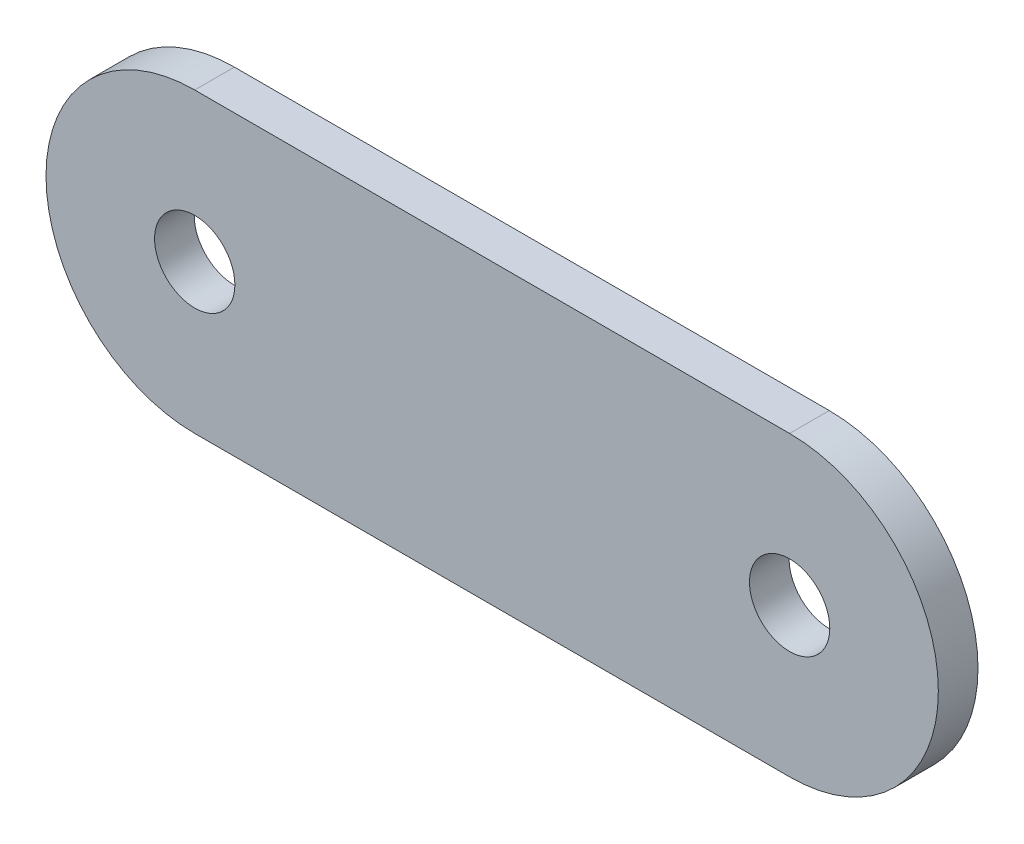
ISO-10303-21;
HEADER;
FILE_DESCRIPTION(('STEP AP214'),'2;1');
FILE_NAME('part.step','',(''),(''),'','','');
FILE_SCHEMA(('AUTOMOTIVE_DESIGN { 1 0 10303 214 1 1 1 1 }'));
ENDSEC;
DATA;
#1=APPLICATION_CONTEXT('core data for automotive mechanical design processes');
#2=APPLICATION_PROTOCOL_DEFINITION('international standard','automotive_design',2000,#1);
#3=PRODUCT_CONTEXT('',#1,'mechanical');
#4=PRODUCT('Part','Part','',(#3));
#5=PRODUCT_RELATED_PRODUCT_CATEGORY('part','',(#4));
#6=PRODUCT_DEFINITION_FORMATION('','',#4);
#7=PRODUCT_DEFINITION_CONTEXT('part definition',#1,'design');
#8=PRODUCT_DEFINITION('design','',#6,#7);
#9=PRODUCT_DEFINITION_SHAPE('','',#8);
#10=(LENGTH_UNIT() NAMED_UNIT(*) SI_UNIT(.MILLI.,.METRE.));
#11=(NAMED_UNIT(*) PLANE_ANGLE_UNIT() SI_UNIT($,.RADIAN.));
#12=(NAMED_UNIT(*) SI_UNIT($,.STERADIAN.) SOLID_ANGLE_UNIT());
#13=UNCERTAINTY_MEASURE_WITH_UNIT(LENGTH_MEASURE(1.E-05),#10,'distance_accuracy_value','');
#14=(GEOMETRIC_REPRESENTATION_CONTEXT(3) GLOBAL_UNCERTAINTY_ASSIGNED_CONTEXT((#13)) GLOBAL_UNIT_ASSIGNED_CONTEXT((#10,
#11,#12)) REPRESENTATION_CONTEXT('',''));
#15=CARTESIAN_POINT('',(0.,0.,0.));
#16=DIRECTION('',(0.,0.,1.));
#17=DIRECTION('',(1.,0.,0.));
#18=AXIS2_PLACEMENT_3D('',#15,#16,#17);
#19=CARTESIAN_POINT('',(75.,15.,4.));
#20=DIRECTION('',(0.,0.,1.));
#21=DIRECTION('',(1.,0.,0.));
#22=AXIS2_PLACEMENT_3D('',#19,#20,#21);
#23=PLANE('',#22);
#24=CARTESIAN_POINT('',(15.,15.,4.));
#25=DIRECTION('',(0.,0.,1.));
#26=DIRECTION('',(1.,0.,0.));
#27=AXIS2_PLACEMENT_3D('',#24,#25,#26);
#28=CIRCLE('',#27,4.05);
#29=CARTESIAN_POINT('',(19.05,15.,4.));
#30=VERTEX_POINT('',#29);
#31=EDGE_CURVE('E110',#30,#30,#28,.T.);
#32=ORIENTED_EDGE('',*,*,#31,.F.);
#33=EDGE_LOOP('',(#32));
#34=FACE_BOUND('',#33,.T.);
#35=CARTESIAN_POINT('',(75.,15.,4.));
#36=DIRECTION('',(0.,0.,1.));
#37=DIRECTION('',(1.,0.,0.));
#38=AXIS2_PLACEMENT_3D('',#35,#36,#37);
#39=CIRCLE('',#38,15.);
#40=CARTESIAN_POINT('',(75.,0.,4.));
#41=VERTEX_POINT('',#40);
#42=CARTESIAN_POINT('',(75.,30.,4.));
#43=VERTEX_POINT('',#42);
#44=EDGE_CURVE('E95',#41,#43,#39,.T.);
#45=ORIENTED_EDGE('',*,*,#44,.T.);
#46=DIRECTION('',(-1.,0.,0.));
#47=VECTOR('',#46,1.);
#48=CARTESIAN_POINT('',(15.,30.,4.));
#49=LINE('',#48,#47);
#50=CARTESIAN_POINT('',(15.,30.,4.));
#51=VERTEX_POINT('',#50);
#52=EDGE_CURVE('E90',#43,#51,#49,.T.);
#53=ORIENTED_EDGE('',*,*,#52,.T.);
#54=CARTESIAN_POINT('',(15.,15.,4.));
#55=DIRECTION('',(0.,0.,1.));
#56=DIRECTION('',(1.,0.,0.));
#57=AXIS2_PLACEMENT_3D('',#54,#55,#56);
#58=CIRCLE('',#57,15.);
#59=CARTESIAN_POINT('',(15.,0.,4.));
#60=VERTEX_POINT('',#59);
#61=EDGE_CURVE('E93',#51,#60,#58,.T.);
#62=ORIENTED_EDGE('',*,*,#61,.T.);
#63=DIRECTION('',(1.,0.,0.));
#64=VECTOR('',#63,1.);
#65=CARTESIAN_POINT('',(15.,0.,4.));
#66=LINE('',#65,#64);
#67=EDGE_CURVE('E60',#60,#41,#66,.T.);
#68=ORIENTED_EDGE('',*,*,#67,.T.);
#69=EDGE_LOOP('',(#45,#53,#62,#68));
#70=FACE_BOUND('',#69,.T.);
#71=CARTESIAN_POINT('',(75.,15.,4.));
#72=DIRECTION('',(0.,0.,1.));
#73=DIRECTION('',(1.,0.,0.));
#74=AXIS2_PLACEMENT_3D('',#71,#72,#73);
#75=CIRCLE('',#74,4.05);
#76=CARTESIAN_POINT('',(79.05,15.,4.));
#77=VERTEX_POINT('',#76);
#78=EDGE_CURVE('E125',#77,#77,#75,.T.);
#79=ORIENTED_EDGE('',*,*,#78,.F.);
#80=EDGE_LOOP('',(#79));
#81=FACE_BOUND('',#80,.T.);
#82=ADVANCED_FACE('F43',(#34,#70,#81),#23,.T.);
#83=CARTESIAN_POINT('',(75.,15.,0.));
#84=DIRECTION('',(0.,0.,1.));
#85=DIRECTION('',(1.,0.,0.));
#86=AXIS2_PLACEMENT_3D('',#83,#84,#85);
#87=PLANE('',#86);
#88=CARTESIAN_POINT('',(75.,15.,0.));
#89=DIRECTION('',(0.,0.,1.));
#90=DIRECTION('',(1.,0.,0.));
#91=AXIS2_PLACEMENT_3D('',#88,#89,#90);
#92=CIRCLE('',#91,15.);
#93=CARTESIAN_POINT('',(75.,0.,0.));
#94=VERTEX_POINT('',#93);
#95=CARTESIAN_POINT('',(75.,30.,0.));
#96=VERTEX_POINT('',#95);
#97=EDGE_CURVE('E107',#94,#96,#92,.T.);
#98=ORIENTED_EDGE('',*,*,#97,.F.);
#99=DIRECTION('',(1.,0.,0.));
#100=VECTOR('',#99,1.);
#101=CARTESIAN_POINT('',(15.,0.,0.));
#102=LINE('',#101,#100);
#103=CARTESIAN_POINT('',(15.,0.,0.));
#104=VERTEX_POINT('',#103);
#105=EDGE_CURVE('E83',#104,#94,#102,.T.);
#106=ORIENTED_EDGE('',*,*,#105,.F.);
#107=CARTESIAN_POINT('',(15.,15.,0.));
#108=DIRECTION('',(0.,0.,1.));
#109=DIRECTION('',(1.,0.,0.));
#110=AXIS2_PLACEMENT_3D('',#107,#108,#109);
#111=CIRCLE('',#110,15.);
#112=CARTESIAN_POINT('',(15.,30.,0.));
#113=VERTEX_POINT('',#112);
#114=EDGE_CURVE('E77',#113,#104,#111,.T.);
#115=ORIENTED_EDGE('',*,*,#114,.F.);
#116=DIRECTION('',(-1.,0.,0.));
#117=VECTOR('',#116,1.);
#118=CARTESIAN_POINT('',(15.,30.,0.));
#119=LINE('',#118,#117);
#120=EDGE_CURVE('E99',#96,#113,#119,.T.);
#121=ORIENTED_EDGE('',*,*,#120,.F.);
#122=EDGE_LOOP('',(#98,#106,#115,#121));
#123=FACE_BOUND('',#122,.T.);
#124=CARTESIAN_POINT('',(15.,15.,0.));
#125=DIRECTION('',(0.,0.,1.));
#126=DIRECTION('',(1.,0.,0.));
#127=AXIS2_PLACEMENT_3D('',#124,#125,#126);
#128=CIRCLE('',#127,4.05);
#129=CARTESIAN_POINT('',(19.05,15.,0.));
#130=VERTEX_POINT('',#129);
#131=EDGE_CURVE('E122',#130,#130,#128,.T.);
#132=ORIENTED_EDGE('',*,*,#131,.T.);
#133=EDGE_LOOP('',(#132));
#134=FACE_BOUND('',#133,.T.);
#135=CARTESIAN_POINT('',(75.,15.,0.));
#136=DIRECTION('',(0.,0.,1.));
#137=DIRECTION('',(1.,0.,0.));
#138=AXIS2_PLACEMENT_3D('',#135,#136,#137);
#139=CIRCLE('',#138,4.05);
#140=CARTESIAN_POINT('',(79.05,15.,0.));
#141=VERTEX_POINT('',#140);
#142=EDGE_CURVE('E128',#141,#141,#139,.T.);
#143=ORIENTED_EDGE('',*,*,#142,.T.);
#144=EDGE_LOOP('',(#143));
#145=FACE_BOUND('',#144,.T.);
#146=ADVANCED_FACE('F118',(#123,#134,#145),#87,.F.);
#147=CARTESIAN_POINT('',(75.,15.,4.));
#148=DIRECTION('',(0.,0.,-1.));
#149=DIRECTION('',(-1.,0.,0.));
#150=AXIS2_PLACEMENT_3D('',#147,#148,#149);
#151=CYLINDRICAL_SURFACE('',#150,15.);
#152=ORIENTED_EDGE('',*,*,#97,.T.);
#153=DIRECTION('',(0.,0.,-1.));
#154=VECTOR('',#153,1.);
#155=CARTESIAN_POINT('',(75.,30.,4.));
#156=LINE('',#155,#154);
#157=EDGE_CURVE('E11',#43,#96,#156,.T.);
#158=ORIENTED_EDGE('',*,*,#157,.F.);
#159=ORIENTED_EDGE('',*,*,#44,.F.);
#160=DIRECTION('',(0.,0.,-1.));
#161=VECTOR('',#160,1.);
#162=CARTESIAN_POINT('',(75.,0.,4.));
#163=LINE('',#162,#161);
#164=EDGE_CURVE('E103',#41,#94,#163,.T.);
#165=ORIENTED_EDGE('',*,*,#164,.T.);
#166=EDGE_LOOP('',(#152,#158,#159,#165));
#167=FACE_BOUND('',#166,.T.);
#168=ADVANCED_FACE('F45',(#167),#151,.T.);
#169=CARTESIAN_POINT('',(15.,30.,4.));
#170=DIRECTION('',(0.,-1.,0.));
#171=DIRECTION('',(0.,0.,-1.));
#172=AXIS2_PLACEMENT_3D('',#169,#170,#171);
#173=PLANE('',#172);
#174=ORIENTED_EDGE('',*,*,#120,.T.);
#175=DIRECTION('',(0.,0.,-1.));
#176=VECTOR('',#175,1.);
#177=CARTESIAN_POINT('',(15.,30.,4.));
#178=LINE('',#177,#176);
#179=EDGE_CURVE('E52',#51,#113,#178,.T.);
#180=ORIENTED_EDGE('',*,*,#179,.F.);
#181=ORIENTED_EDGE('',*,*,#52,.F.);
#182=ORIENTED_EDGE('',*,*,#157,.T.);
#183=EDGE_LOOP('',(#174,#180,#181,#182));
#184=FACE_BOUND('',#183,.T.);
#185=ADVANCED_FACE('F98',(#184),#173,.F.);
#186=CARTESIAN_POINT('',(15.,15.,4.));
#187=DIRECTION('',(0.,0.,-1.));
#188=DIRECTION('',(-1.,0.,0.));
#189=AXIS2_PLACEMENT_3D('',#186,#187,#188);
#190=CYLINDRICAL_SURFACE('',#189,15.);
#191=ORIENTED_EDGE('',*,*,#114,.T.);
#192=DIRECTION('',(0.,0.,-1.));
#193=VECTOR('',#192,1.);
#194=CARTESIAN_POINT('',(15.,0.,4.));
#195=LINE('',#194,#193);
#196=EDGE_CURVE('E100',#60,#104,#195,.T.);
#197=ORIENTED_EDGE('',*,*,#196,.F.);
#198=ORIENTED_EDGE('',*,*,#61,.F.);
#199=ORIENTED_EDGE('',*,*,#179,.T.);
#200=EDGE_LOOP('',(#191,#197,#198,#199));
#201=FACE_BOUND('',#200,.T.);
#202=ADVANCED_FACE('F101',(#201),#190,.T.);
#203=CARTESIAN_POINT('',(15.,0.,4.));
#204=DIRECTION('',(0.,1.,0.));
#205=DIRECTION('',(0.,0.,1.));
#206=AXIS2_PLACEMENT_3D('',#203,#204,#205);
#207=PLANE('',#206);
#208=ORIENTED_EDGE('',*,*,#105,.T.);
#209=ORIENTED_EDGE('',*,*,#164,.F.);
#210=ORIENTED_EDGE('',*,*,#67,.F.);
#211=ORIENTED_EDGE('',*,*,#196,.T.);
#212=EDGE_LOOP('',(#208,#209,#210,#211));
#213=FACE_BOUND('',#212,.T.);
#214=ADVANCED_FACE('F115',(#213),#207,.F.);
#215=CARTESIAN_POINT('',(15.,15.,4.));
#216=DIRECTION('',(0.,0.,-1.));
#217=DIRECTION('',(-1.,0.,0.));
#218=AXIS2_PLACEMENT_3D('',#215,#216,#217);
#219=CYLINDRICAL_SURFACE('',#218,4.05);
#220=ORIENTED_EDGE('',*,*,#31,.T.);
#221=EDGE_LOOP('',(#220));
#222=FACE_BOUND('',#221,.T.);
#223=ORIENTED_EDGE('',*,*,#131,.F.);
#224=EDGE_LOOP('',(#223));
#225=FACE_BOUND('',#224,.T.);
#226=ADVANCED_FACE('F145',(#222,#225),#219,.F.);
#227=CARTESIAN_POINT('',(75.,15.,4.));
#228=DIRECTION('',(0.,0.,-1.));
#229=DIRECTION('',(-1.,0.,0.));
#230=AXIS2_PLACEMENT_3D('',#227,#228,#229);
#231=CYLINDRICAL_SURFACE('',#230,4.05);
#232=ORIENTED_EDGE('',*,*,#78,.T.);
#233=EDGE_LOOP('',(#232));
#234=FACE_BOUND('',#233,.T.);
#235=ORIENTED_EDGE('',*,*,#142,.F.);
#236=EDGE_LOOP('',(#235));
#237=FACE_BOUND('',#236,.T.);
#238=ADVANCED_FACE('F134',(#234,#237),#231,.F.);
#239=CLOSED_SHELL('',(#82,#146,#168,#185,#202,#214,#226,#238));
#240=MANIFOLD_SOLID_BREP('B2',#239);
#241=ADVANCED_BREP_SHAPE_REPRESENTATION('',(#18,#240),#14);
#242=SHAPE_DEFINITION_REPRESENTATION(#9,#241);
ENDSEC;
END-ISO-10303-21;
